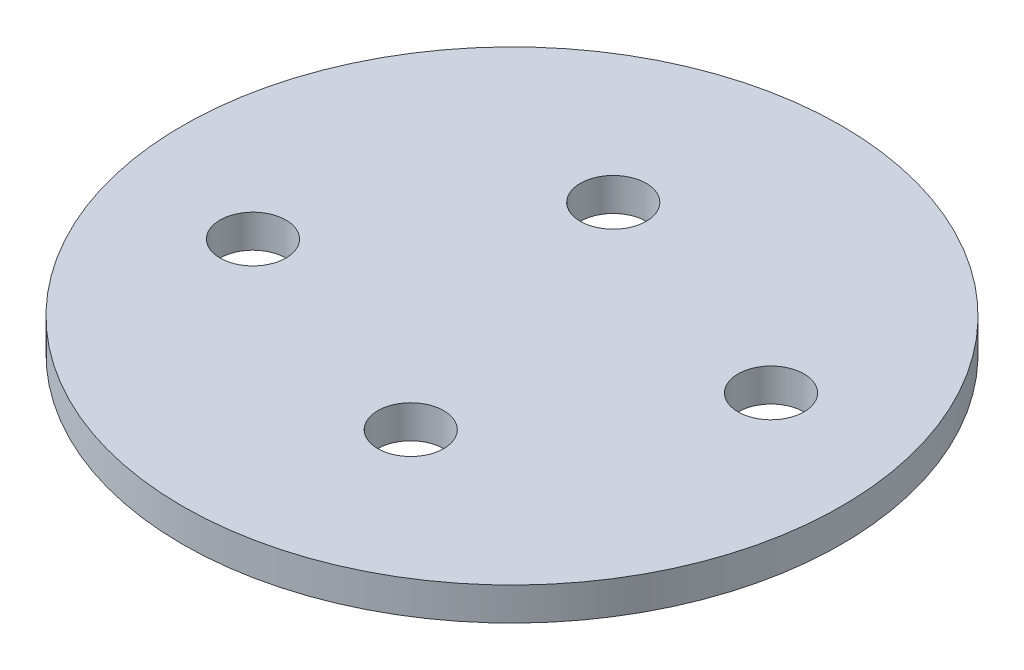
ISO-10303-21;
HEADER;
FILE_DESCRIPTION(('STEP AP214'),'2;1');
FILE_NAME('part.step','',(''),(''),'','','');
FILE_SCHEMA(('AUTOMOTIVE_DESIGN { 1 0 10303 214 1 1 1 1 }'));
ENDSEC;
DATA;
#1=APPLICATION_CONTEXT('core data for automotive mechanical design processes');
#2=APPLICATION_PROTOCOL_DEFINITION('international standard','automotive_design',2000,#1);
#3=PRODUCT_CONTEXT('',#1,'mechanical');
#4=PRODUCT('Part','Part','',(#3));
#5=PRODUCT_RELATED_PRODUCT_CATEGORY('part','',(#4));
#6=PRODUCT_DEFINITION_FORMATION('','',#4);
#7=PRODUCT_DEFINITION_CONTEXT('part definition',#1,'design');
#8=PRODUCT_DEFINITION('design','',#6,#7);
#9=PRODUCT_DEFINITION_SHAPE('','',#8);
#10=(LENGTH_UNIT() NAMED_UNIT(*) SI_UNIT(.MILLI.,.METRE.));
#11=(NAMED_UNIT(*) PLANE_ANGLE_UNIT() SI_UNIT($,.RADIAN.));
#12=(NAMED_UNIT(*) SI_UNIT($,.STERADIAN.) SOLID_ANGLE_UNIT());
#13=UNCERTAINTY_MEASURE_WITH_UNIT(LENGTH_MEASURE(1.E-05),#10,'distance_accuracy_value','');
#14=(GEOMETRIC_REPRESENTATION_CONTEXT(3) GLOBAL_UNCERTAINTY_ASSIGNED_CONTEXT((#13)) GLOBAL_UNIT_ASSIGNED_CONTEXT((#10,
#11,#12)) REPRESENTATION_CONTEXT('',''));
#15=CARTESIAN_POINT('',(0.,0.,0.));
#16=DIRECTION('',(0.,0.,1.));
#17=DIRECTION('',(1.,0.,0.));
#18=AXIS2_PLACEMENT_3D('',#15,#16,#17);
#19=CARTESIAN_POINT('',(200.890818544296,2.,207.036150124052));
#20=DIRECTION('',(0.,-1.,0.));
#21=DIRECTION('',(0.,0.,-1.));
#22=AXIS2_PLACEMENT_3D('',#19,#20,#21);
#23=CYLINDRICAL_SURFACE('',#22,2.);
#24=CARTESIAN_POINT('',(200.890818544296,2.,207.036150124052));
#25=DIRECTION('',(0.,1.,0.));
#26=DIRECTION('',(0.,0.,1.));
#27=AXIS2_PLACEMENT_3D('',#24,#25,#26);
#28=CIRCLE('',#27,2.);
#29=CARTESIAN_POINT('',(200.890818544296,2.,209.036150124052));
#30=VERTEX_POINT('',#29);
#31=EDGE_CURVE('E49',#30,#30,#28,.T.);
#32=ORIENTED_EDGE('',*,*,#31,.T.);
#33=EDGE_LOOP('',(#32));
#34=FACE_BOUND('',#33,.T.);
#35=CARTESIAN_POINT('',(200.890818544296,0.,207.036150124052));
#36=DIRECTION('',(0.,1.,0.));
#37=DIRECTION('',(0.,0.,1.));
#38=AXIS2_PLACEMENT_3D('',#35,#36,#37);
#39=CIRCLE('',#38,2.);
#40=CARTESIAN_POINT('',(200.890818544296,0.,209.036150124052));
#41=VERTEX_POINT('',#40);
#42=EDGE_CURVE('E66',#41,#41,#39,.T.);
#43=ORIENTED_EDGE('',*,*,#42,.F.);
#44=EDGE_LOOP('',(#43));
#45=FACE_BOUND('',#44,.T.);
#46=ADVANCED_FACE('F41',(#34,#45),#23,.F.);
#47=CARTESIAN_POINT('',(197.989898732234,2.,197.989898732233));
#48=DIRECTION('',(0.,-1.,0.));
#49=DIRECTION('',(0.,0.,-1.));
#50=AXIS2_PLACEMENT_3D('',#47,#48,#49);
#51=CYLINDRICAL_SURFACE('',#50,20.);
#52=CARTESIAN_POINT('',(197.989898732234,2.,197.989898732233));
#53=DIRECTION('',(0.,1.,0.));
#54=DIRECTION('',(0.,0.,1.));
#55=AXIS2_PLACEMENT_3D('',#52,#53,#54);
#56=CIRCLE('',#55,20.);
#57=CARTESIAN_POINT('',(197.989898732234,2.,217.989898732233));
#58=VERTEX_POINT('',#57);
#59=EDGE_CURVE('E54',#58,#58,#56,.T.);
#60=ORIENTED_EDGE('',*,*,#59,.F.);
#61=EDGE_LOOP('',(#60));
#62=FACE_BOUND('',#61,.T.);
#63=CARTESIAN_POINT('',(197.989898732234,0.,197.989898732233));
#64=DIRECTION('',(0.,1.,0.));
#65=DIRECTION('',(0.,0.,1.));
#66=AXIS2_PLACEMENT_3D('',#63,#64,#65);
#67=CIRCLE('',#66,20.);
#68=CARTESIAN_POINT('',(197.989898732234,0.,217.989898732233));
#69=VERTEX_POINT('',#68);
#70=EDGE_CURVE('E64',#69,#69,#67,.T.);
#71=ORIENTED_EDGE('',*,*,#70,.T.);
#72=EDGE_LOOP('',(#71));
#73=FACE_BOUND('',#72,.T.);
#74=ADVANCED_FACE('F87',(#62,#73),#51,.T.);
#75=CARTESIAN_POINT('',(195.088978920172,2.,188.943647340414));
#76=DIRECTION('',(0.,-1.,0.));
#77=DIRECTION('',(0.,0.,-1.));
#78=AXIS2_PLACEMENT_3D('',#75,#76,#77);
#79=CYLINDRICAL_SURFACE('',#78,2.);
#80=CARTESIAN_POINT('',(195.088978920172,2.,188.943647340414));
#81=DIRECTION('',(0.,1.,0.));
#82=DIRECTION('',(0.,0.,1.));
#83=AXIS2_PLACEMENT_3D('',#80,#81,#82);
#84=CIRCLE('',#83,2.);
#85=CARTESIAN_POINT('',(195.088978920172,2.,190.943647340414));
#86=VERTEX_POINT('',#85);
#87=EDGE_CURVE('E75',#86,#86,#84,.T.);
#88=ORIENTED_EDGE('',*,*,#87,.T.);
#89=EDGE_LOOP('',(#88));
#90=FACE_BOUND('',#89,.T.);
#91=CARTESIAN_POINT('',(195.088978920172,0.,188.943647340414));
#92=DIRECTION('',(0.,1.,0.));
#93=DIRECTION('',(0.,0.,1.));
#94=AXIS2_PLACEMENT_3D('',#91,#92,#93);
#95=CIRCLE('',#94,2.);
#96=CARTESIAN_POINT('',(195.088978920172,0.,190.943647340414));
#97=VERTEX_POINT('',#96);
#98=EDGE_CURVE('E61',#97,#97,#95,.T.);
#99=ORIENTED_EDGE('',*,*,#98,.F.);
#100=EDGE_LOOP('',(#99));
#101=FACE_BOUND('',#100,.T.);
#102=ADVANCED_FACE('F90',(#90,#101),#79,.F.);
#103=CARTESIAN_POINT('',(186.086936374577,2.,201.806898484946));
#104=DIRECTION('',(0.,-1.,0.));
#105=DIRECTION('',(0.,0.,-1.));
#106=AXIS2_PLACEMENT_3D('',#103,#104,#105);
#107=CYLINDRICAL_SURFACE('',#106,2.);
#108=CARTESIAN_POINT('',(186.086936374577,2.,201.806898484946));
#109=DIRECTION('',(0.,1.,0.));
#110=DIRECTION('',(0.,0.,1.));
#111=AXIS2_PLACEMENT_3D('',#108,#109,#110);
#112=CIRCLE('',#111,2.);
#113=CARTESIAN_POINT('',(186.086936374577,2.,203.806898484946));
#114=VERTEX_POINT('',#113);
#115=EDGE_CURVE('E71',#114,#114,#112,.T.);
#116=ORIENTED_EDGE('',*,*,#115,.T.);
#117=EDGE_LOOP('',(#116));
#118=FACE_BOUND('',#117,.T.);
#119=CARTESIAN_POINT('',(186.086936374577,0.,201.806898484946));
#120=DIRECTION('',(0.,1.,0.));
#121=DIRECTION('',(0.,0.,1.));
#122=AXIS2_PLACEMENT_3D('',#119,#120,#121);
#123=CIRCLE('',#122,2.);
#124=CARTESIAN_POINT('',(186.086936374577,0.,203.806898484946));
#125=VERTEX_POINT('',#124);
#126=EDGE_CURVE('E58',#125,#125,#123,.T.);
#127=ORIENTED_EDGE('',*,*,#126,.F.);
#128=EDGE_LOOP('',(#127));
#129=FACE_BOUND('',#128,.T.);
#130=ADVANCED_FACE('F43',(#118,#129),#107,.F.);
#131=CARTESIAN_POINT('',(209.89286108989,2.,194.17289897952));
#132=DIRECTION('',(0.,-1.,0.));
#133=DIRECTION('',(0.,0.,-1.));
#134=AXIS2_PLACEMENT_3D('',#131,#132,#133);
#135=CYLINDRICAL_SURFACE('',#134,2.);
#136=CARTESIAN_POINT('',(209.89286108989,2.,194.17289897952));
#137=DIRECTION('',(0.,1.,0.));
#138=DIRECTION('',(0.,0.,1.));
#139=AXIS2_PLACEMENT_3D('',#136,#137,#138);
#140=CIRCLE('',#139,2.);
#141=CARTESIAN_POINT('',(209.89286108989,2.,196.17289897952));
#142=VERTEX_POINT('',#141);
#143=EDGE_CURVE('E10',#142,#142,#140,.T.);
#144=ORIENTED_EDGE('',*,*,#143,.T.);
#145=EDGE_LOOP('',(#144));
#146=FACE_BOUND('',#145,.T.);
#147=CARTESIAN_POINT('',(209.89286108989,0.,194.17289897952));
#148=DIRECTION('',(0.,1.,0.));
#149=DIRECTION('',(0.,0.,1.));
#150=AXIS2_PLACEMENT_3D('',#147,#148,#149);
#151=CIRCLE('',#150,2.);
#152=CARTESIAN_POINT('',(209.89286108989,0.,196.17289897952));
#153=VERTEX_POINT('',#152);
#154=EDGE_CURVE('E45',#153,#153,#151,.T.);
#155=ORIENTED_EDGE('',*,*,#154,.F.);
#156=EDGE_LOOP('',(#155));
#157=FACE_BOUND('',#156,.T.);
#158=ADVANCED_FACE('F101',(#146,#157),#135,.F.);
#159=CARTESIAN_POINT('',(0.,2.,0.));
#160=DIRECTION('',(0.,1.,0.));
#161=DIRECTION('',(0.,0.,1.));
#162=AXIS2_PLACEMENT_3D('',#159,#160,#161);
#163=PLANE('',#162);
#164=ORIENTED_EDGE('',*,*,#115,.F.);
#165=EDGE_LOOP('',(#164));
#166=FACE_BOUND('',#165,.T.);
#167=ORIENTED_EDGE('',*,*,#87,.F.);
#168=EDGE_LOOP('',(#167));
#169=FACE_BOUND('',#168,.T.);
#170=ORIENTED_EDGE('',*,*,#59,.T.);
#171=EDGE_LOOP('',(#170));
#172=FACE_BOUND('',#171,.T.);
#173=ORIENTED_EDGE('',*,*,#31,.F.);
#174=EDGE_LOOP('',(#173));
#175=FACE_BOUND('',#174,.T.);
#176=ORIENTED_EDGE('',*,*,#143,.F.);
#177=EDGE_LOOP('',(#176));
#178=FACE_BOUND('',#177,.T.);
#179=ADVANCED_FACE('F84',(#166,#169,#172,#175,#178),#163,.T.);
#180=CARTESIAN_POINT('',(0.,0.,0.));
#181=DIRECTION('',(0.,1.,0.));
#182=DIRECTION('',(0.,0.,1.));
#183=AXIS2_PLACEMENT_3D('',#180,#181,#182);
#184=PLANE('',#183);
#185=ORIENTED_EDGE('',*,*,#126,.T.);
#186=EDGE_LOOP('',(#185));
#187=FACE_BOUND('',#186,.T.);
#188=ORIENTED_EDGE('',*,*,#98,.T.);
#189=EDGE_LOOP('',(#188));
#190=FACE_BOUND('',#189,.T.);
#191=ORIENTED_EDGE('',*,*,#70,.F.);
#192=EDGE_LOOP('',(#191));
#193=FACE_BOUND('',#192,.T.);
#194=ORIENTED_EDGE('',*,*,#42,.T.);
#195=EDGE_LOOP('',(#194));
#196=FACE_BOUND('',#195,.T.);
#197=ORIENTED_EDGE('',*,*,#154,.T.);
#198=EDGE_LOOP('',(#197));
#199=FACE_BOUND('',#198,.T.);
#200=ADVANCED_FACE('F94',(#187,#190,#193,#196,#199),#184,.F.);
#201=CLOSED_SHELL('',(#46,#74,#102,#130,#158,#179,#200));
#202=MANIFOLD_SOLID_BREP('B2',#201);
#203=ADVANCED_BREP_SHAPE_REPRESENTATION('',(#18,#202),#14);
#204=SHAPE_DEFINITION_REPRESENTATION(#9,#203);
ENDSEC;
END-ISO-10303-21;
